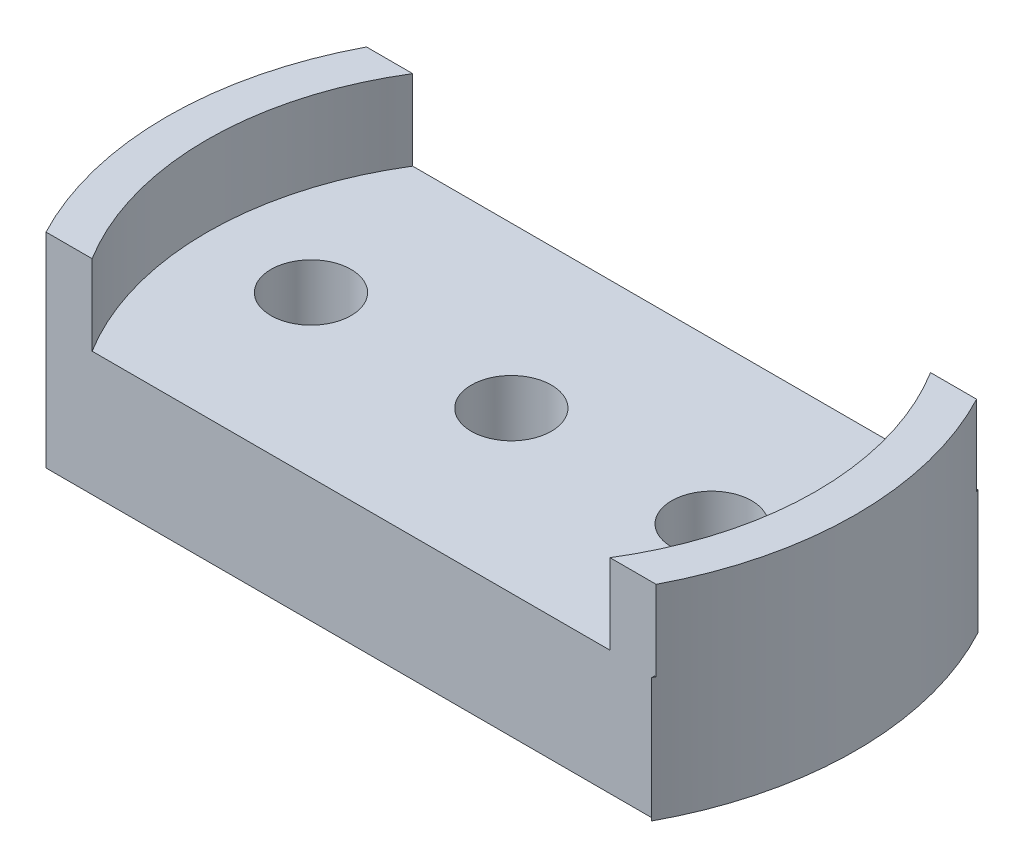
ISO-10303-21;
HEADER;
FILE_DESCRIPTION(('STEP AP214'),'2;1');
FILE_NAME('part.step','',(''),(''),'','','');
FILE_SCHEMA(('AUTOMOTIVE_DESIGN { 1 0 10303 214 1 1 1 1 }'));
ENDSEC;
DATA;
#1=APPLICATION_CONTEXT('core data for automotive mechanical design processes');
#2=APPLICATION_PROTOCOL_DEFINITION('international standard','automotive_design',2000,#1);
#3=PRODUCT_CONTEXT('',#1,'mechanical');
#4=PRODUCT('Part','Part','',(#3));
#5=PRODUCT_RELATED_PRODUCT_CATEGORY('part','',(#4));
#6=PRODUCT_DEFINITION_FORMATION('','',#4);
#7=PRODUCT_DEFINITION_CONTEXT('part definition',#1,'design');
#8=PRODUCT_DEFINITION('design','',#6,#7);
#9=PRODUCT_DEFINITION_SHAPE('','',#8);
#10=(LENGTH_UNIT() NAMED_UNIT(*) SI_UNIT(.MILLI.,.METRE.));
#11=(NAMED_UNIT(*) PLANE_ANGLE_UNIT() SI_UNIT($,.RADIAN.));
#12=(NAMED_UNIT(*) SI_UNIT($,.STERADIAN.) SOLID_ANGLE_UNIT());
#13=UNCERTAINTY_MEASURE_WITH_UNIT(LENGTH_MEASURE(1.E-05),#10,'distance_accuracy_value','');
#14=(GEOMETRIC_REPRESENTATION_CONTEXT(3) GLOBAL_UNCERTAINTY_ASSIGNED_CONTEXT((#13)) GLOBAL_UNIT_ASSIGNED_CONTEXT((#10,
#11,#12)) REPRESENTATION_CONTEXT('',''));
#15=CARTESIAN_POINT('',(0.,0.,0.));
#16=DIRECTION('',(0.,0.,1.));
#17=DIRECTION('',(1.,0.,0.));
#18=AXIS2_PLACEMENT_3D('',#15,#16,#17);
#19=CARTESIAN_POINT('',(0.,15.5,0.));
#20=DIRECTION('',(0.,1.,0.));
#21=DIRECTION('',(0.,0.,1.));
#22=AXIS2_PLACEMENT_3D('',#19,#20,#21);
#23=PLANE('',#22);
#24=CARTESIAN_POINT('',(25.,15.5,0.));
#25=DIRECTION('',(0.,1.,0.));
#26=DIRECTION('',(0.,0.,1.));
#27=AXIS2_PLACEMENT_3D('',#24,#25,#26);
#28=CIRCLE('',#27,5.);
#29=CARTESIAN_POINT('',(25.,15.5,5.));
#30=VERTEX_POINT('',#29);
#31=EDGE_CURVE('E312',#30,#30,#28,.T.);
#32=ORIENTED_EDGE('',*,*,#31,.F.);
#33=EDGE_LOOP('',(#32));
#34=FACE_BOUND('',#33,.T.);
#35=CARTESIAN_POINT('',(-25.,15.5,0.));
#36=DIRECTION('',(0.,1.,0.));
#37=DIRECTION('',(0.,0.,1.));
#38=AXIS2_PLACEMENT_3D('',#35,#36,#37);
#39=CIRCLE('',#38,5.);
#40=CARTESIAN_POINT('',(-25.,15.5,5.));
#41=VERTEX_POINT('',#40);
#42=EDGE_CURVE('E316',#41,#41,#39,.T.);
#43=ORIENTED_EDGE('',*,*,#42,.F.);
#44=EDGE_LOOP('',(#43));
#45=FACE_BOUND('',#44,.T.);
#46=CARTESIAN_POINT('',(0.,15.5,0.));
#47=DIRECTION('',(0.,1.,0.));
#48=DIRECTION('',(0.,0.,1.));
#49=AXIS2_PLACEMENT_3D('',#46,#47,#48);
#50=CIRCLE('',#49,5.);
#51=CARTESIAN_POINT('',(0.,15.5,5.));
#52=VERTEX_POINT('',#51);
#53=EDGE_CURVE('E298',#52,#52,#50,.T.);
#54=ORIENTED_EDGE('',*,*,#53,.F.);
#55=EDGE_LOOP('',(#54));
#56=FACE_BOUND('',#55,.T.);
#57=DIRECTION('',(-1.,0.,0.));
#58=VECTOR('',#57,1.);
#59=CARTESIAN_POINT('',(-38.0657326213486,15.5,20.));
#60=LINE('',#59,#58);
#61=CARTESIAN_POINT('',(32.310988842807,15.5,20.));
#62=VERTEX_POINT('',#61);
#63=CARTESIAN_POINT('',(-32.310988842807,15.5,20.));
#64=VERTEX_POINT('',#63);
#65=EDGE_CURVE('E257',#62,#64,#60,.T.);
#66=ORIENTED_EDGE('',*,*,#65,.F.);
#67=CARTESIAN_POINT('',(0.,15.5,0.));
#68=DIRECTION('',(0.,-1.,0.));
#69=DIRECTION('',(0.,0.,1.));
#70=AXIS2_PLACEMENT_3D('',#67,#68,#69);
#71=CIRCLE('',#70,38.);
#72=CARTESIAN_POINT('',(32.310988842807,15.5,-20.));
#73=VERTEX_POINT('',#72);
#74=EDGE_CURVE('E130',#73,#62,#71,.T.);
#75=ORIENTED_EDGE('',*,*,#74,.F.);
#76=DIRECTION('',(1.,0.,0.));
#77=VECTOR('',#76,1.);
#78=CARTESIAN_POINT('',(-38.0657326213486,15.5,-20.));
#79=LINE('',#78,#77);
#80=CARTESIAN_POINT('',(-32.310988842807,15.5,-20.));
#81=VERTEX_POINT('',#80);
#82=EDGE_CURVE('E280',#81,#73,#79,.T.);
#83=ORIENTED_EDGE('',*,*,#82,.F.);
#84=CARTESIAN_POINT('',(0.,15.5,0.));
#85=DIRECTION('',(0.,-1.,0.));
#86=DIRECTION('',(0.,0.,1.));
#87=AXIS2_PLACEMENT_3D('',#84,#85,#86);
#88=CIRCLE('',#87,38.);
#89=EDGE_CURVE('E186',#64,#81,#88,.T.);
#90=ORIENTED_EDGE('',*,*,#89,.F.);
#91=EDGE_LOOP('',(#66,#75,#83,#90));
#92=FACE_BOUND('',#91,.T.);
#93=ADVANCED_FACE('F39',(#34,#45,#56,#92),#23,.T.);
#94=DIRECTION('',(0.,0.,-1.));
#95=VECTOR('',#94,1.);
#96=CARTESIAN_POINT('',(37.8745162901658,15.5,-20.));
#97=LINE('',#96,#95);
#98=CARTESIAN_POINT('',(37.8745162901658,15.5,-20.));
#99=VERTEX_POINT('',#98);
#100=CARTESIAN_POINT('',(37.8745162901658,15.5,-20.3597891881514));
#101=VERTEX_POINT('',#100);
#102=EDGE_CURVE('E277',#99,#101,#97,.T.);
#103=ORIENTED_EDGE('',*,*,#102,.F.);
#104=DIRECTION('',(-1.,0.,0.));
#105=VECTOR('',#104,1.);
#106=CARTESIAN_POINT('',(32.310988842807,15.5,-20.));
#107=LINE('',#106,#105);
#108=CARTESIAN_POINT('',(38.0657326213486,15.5,-20.));
#109=VERTEX_POINT('',#108);
#110=EDGE_CURVE('E55',#109,#99,#107,.T.);
#111=ORIENTED_EDGE('',*,*,#110,.F.);
#112=CARTESIAN_POINT('',(0.,15.5,0.));
#113=DIRECTION('',(0.,1.,0.));
#114=DIRECTION('',(0.,0.,1.));
#115=AXIS2_PLACEMENT_3D('',#112,#113,#114);
#116=CIRCLE('',#115,43.);
#117=EDGE_CURVE('E147',#109,#101,#116,.T.);
#118=ORIENTED_EDGE('',*,*,#117,.T.);
#119=EDGE_LOOP('',(#103,#111,#118));
#120=FACE_BOUND('',#119,.T.);
#121=ADVANCED_FACE('F266',(#120),#23,.T.);
#122=CARTESIAN_POINT('',(0.,15.5,0.));
#123=DIRECTION('',(0.,-1.,0.));
#124=DIRECTION('',(0.,0.,-1.));
#125=AXIS2_PLACEMENT_3D('',#122,#123,#124);
#126=CYLINDRICAL_SURFACE('',#125,43.);
#127=CARTESIAN_POINT('',(0.,0.,0.));
#128=DIRECTION('',(0.,1.,0.));
#129=DIRECTION('',(0.,0.,1.));
#130=AXIS2_PLACEMENT_3D('',#127,#128,#129);
#131=CIRCLE('',#130,43.);
#132=CARTESIAN_POINT('',(-38.0657326213486,0.,-20.));
#133=VERTEX_POINT('',#132);
#134=CARTESIAN_POINT('',(-38.0657326213486,0.,20.));
#135=VERTEX_POINT('',#134);
#136=EDGE_CURVE('E146',#133,#135,#131,.T.);
#137=ORIENTED_EDGE('',*,*,#136,.T.);
#138=DIRECTION('',(0.,-1.,0.));
#139=VECTOR('',#138,1.);
#140=CARTESIAN_POINT('',(-38.0657326213486,25.5,20.));
#141=LINE('',#140,#139);
#142=CARTESIAN_POINT('',(-38.0657326213486,25.5,20.));
#143=VERTEX_POINT('',#142);
#144=EDGE_CURVE('E134',#143,#135,#141,.T.);
#145=ORIENTED_EDGE('',*,*,#144,.F.);
#146=CARTESIAN_POINT('',(0.,25.5,0.));
#147=DIRECTION('',(0.,1.,0.));
#148=DIRECTION('',(0.,0.,1.));
#149=AXIS2_PLACEMENT_3D('',#146,#147,#148);
#150=CIRCLE('',#149,43.);
#151=CARTESIAN_POINT('',(-38.0657326213486,25.5,-20.));
#152=VERTEX_POINT('',#151);
#153=EDGE_CURVE('E192',#152,#143,#150,.T.);
#154=ORIENTED_EDGE('',*,*,#153,.F.);
#155=DIRECTION('',(0.,-1.,0.));
#156=VECTOR('',#155,1.);
#157=CARTESIAN_POINT('',(-38.0657326213486,25.5,-20.));
#158=LINE('',#157,#156);
#159=EDGE_CURVE('E207',#152,#133,#158,.T.);
#160=ORIENTED_EDGE('',*,*,#159,.T.);
#161=EDGE_LOOP('',(#137,#145,#154,#160));
#162=FACE_BOUND('',#161,.T.);
#163=ADVANCED_FACE('F229',(#162),#126,.T.);
#164=DIRECTION('',(0.,0.,-1.));
#165=VECTOR('',#164,1.);
#166=CARTESIAN_POINT('',(37.8745162901658,15.5,20.));
#167=LINE('',#166,#165);
#168=CARTESIAN_POINT('',(37.8745162901658,15.5,20.3597891881514));
#169=VERTEX_POINT('',#168);
#170=CARTESIAN_POINT('',(37.8745162901658,15.5,20.));
#171=VERTEX_POINT('',#170);
#172=EDGE_CURVE('E259',#169,#171,#167,.T.);
#173=ORIENTED_EDGE('',*,*,#172,.F.);
#174=CARTESIAN_POINT('',(38.0657326213486,15.5,20.));
#175=VERTEX_POINT('',#174);
#176=EDGE_CURVE('E77',#169,#175,#116,.T.);
#177=ORIENTED_EDGE('',*,*,#176,.T.);
#178=DIRECTION('',(1.,0.,0.));
#179=VECTOR('',#178,1.);
#180=CARTESIAN_POINT('',(32.310988842807,15.5,20.));
#181=LINE('',#180,#179);
#182=EDGE_CURVE('E116',#171,#175,#181,.T.);
#183=ORIENTED_EDGE('',*,*,#182,.F.);
#184=EDGE_LOOP('',(#173,#177,#183));
#185=FACE_BOUND('',#184,.T.);
#186=ADVANCED_FACE('F263',(#185),#23,.T.);
#187=ORIENTED_EDGE('',*,*,#176,.F.);
#188=DIRECTION('',(0.,-1.,0.));
#189=VECTOR('',#188,1.);
#190=CARTESIAN_POINT('',(37.8745162901658,15.5,20.3597891881514));
#191=LINE('',#190,#189);
#192=CARTESIAN_POINT('',(37.8745162901658,0.,20.3597891881514));
#193=VERTEX_POINT('',#192);
#194=EDGE_CURVE('E181',#169,#193,#191,.T.);
#195=ORIENTED_EDGE('',*,*,#194,.T.);
#196=CARTESIAN_POINT('',(37.8745162901658,0.,-20.3597891881514));
#197=VERTEX_POINT('',#196);
#198=EDGE_CURVE('E151',#193,#197,#131,.T.);
#199=ORIENTED_EDGE('',*,*,#198,.T.);
#200=DIRECTION('',(0.,-1.,0.));
#201=VECTOR('',#200,1.);
#202=CARTESIAN_POINT('',(37.8745162901658,15.5,-20.3597891881514));
#203=LINE('',#202,#201);
#204=EDGE_CURVE('E187',#197,#101,#203,.F.);
#205=ORIENTED_EDGE('',*,*,#204,.T.);
#206=ORIENTED_EDGE('',*,*,#117,.F.);
#207=DIRECTION('',(0.,-1.,0.));
#208=VECTOR('',#207,1.);
#209=CARTESIAN_POINT('',(38.0657326213486,25.5,-20.));
#210=LINE('',#209,#208);
#211=CARTESIAN_POINT('',(38.0657326213486,25.5,-20.));
#212=VERTEX_POINT('',#211);
#213=EDGE_CURVE('E120',#212,#109,#210,.T.);
#214=ORIENTED_EDGE('',*,*,#213,.F.);
#215=CARTESIAN_POINT('',(0.,25.5,0.));
#216=DIRECTION('',(0.,1.,0.));
#217=DIRECTION('',(0.,0.,1.));
#218=AXIS2_PLACEMENT_3D('',#215,#216,#217);
#219=CIRCLE('',#218,43.);
#220=CARTESIAN_POINT('',(38.0657326213486,25.5,20.));
#221=VERTEX_POINT('',#220);
#222=EDGE_CURVE('E103',#221,#212,#219,.T.);
#223=ORIENTED_EDGE('',*,*,#222,.F.);
#224=DIRECTION('',(0.,-1.,0.));
#225=VECTOR('',#224,1.);
#226=CARTESIAN_POINT('',(38.0657326213486,25.5,20.));
#227=LINE('',#226,#225);
#228=EDGE_CURVE('E113',#221,#175,#227,.T.);
#229=ORIENTED_EDGE('',*,*,#228,.T.);
#230=EDGE_LOOP('',(#187,#195,#199,#205,#206,#214,#223,#229));
#231=FACE_BOUND('',#230,.T.);
#232=ADVANCED_FACE('F41',(#231),#126,.T.);
#233=CARTESIAN_POINT('',(0.,0.,0.));
#234=DIRECTION('',(0.,1.,0.));
#235=DIRECTION('',(0.,0.,1.));
#236=AXIS2_PLACEMENT_3D('',#233,#234,#235);
#237=PLANE('',#236);
#238=CARTESIAN_POINT('',(25.,0.,0.));
#239=DIRECTION('',(0.,-1.,0.));
#240=DIRECTION('',(0.,0.,-1.));
#241=AXIS2_PLACEMENT_3D('',#238,#239,#240);
#242=CIRCLE('',#241,5.);
#243=CARTESIAN_POINT('',(25.,0.,-5.));
#244=VERTEX_POINT('',#243);
#245=EDGE_CURVE('E320',#244,#244,#242,.T.);
#246=ORIENTED_EDGE('',*,*,#245,.F.);
#247=EDGE_LOOP('',(#246));
#248=FACE_BOUND('',#247,.T.);
#249=CARTESIAN_POINT('',(-25.,0.,0.));
#250=DIRECTION('',(0.,-1.,0.));
#251=DIRECTION('',(0.,0.,1.));
#252=AXIS2_PLACEMENT_3D('',#249,#250,#251);
#253=CIRCLE('',#252,5.);
#254=CARTESIAN_POINT('',(-25.,0.,5.));
#255=VERTEX_POINT('',#254);
#256=EDGE_CURVE('E321',#255,#255,#253,.T.);
#257=ORIENTED_EDGE('',*,*,#256,.F.);
#258=EDGE_LOOP('',(#257));
#259=FACE_BOUND('',#258,.T.);
#260=CARTESIAN_POINT('',(0.,0.,0.));
#261=DIRECTION('',(0.,-1.,0.));
#262=DIRECTION('',(0.,0.,-1.));
#263=AXIS2_PLACEMENT_3D('',#260,#261,#262);
#264=CIRCLE('',#263,5.);
#265=CARTESIAN_POINT('',(0.,0.,-5.));
#266=VERTEX_POINT('',#265);
#267=EDGE_CURVE('E308',#266,#266,#264,.T.);
#268=ORIENTED_EDGE('',*,*,#267,.F.);
#269=EDGE_LOOP('',(#268));
#270=FACE_BOUND('',#269,.T.);
#271=DIRECTION('',(0.,0.,-1.));
#272=VECTOR('',#271,1.);
#273=CARTESIAN_POINT('',(37.8745162901658,0.,0.));
#274=LINE('',#273,#272);
#275=CARTESIAN_POINT('',(37.8745162901658,0.,20.));
#276=VERTEX_POINT('',#275);
#277=EDGE_CURVE('E48',#193,#276,#274,.T.);
#278=ORIENTED_EDGE('',*,*,#277,.T.);
#279=DIRECTION('',(-1.,0.,0.));
#280=VECTOR('',#279,1.);
#281=CARTESIAN_POINT('',(0.,0.,20.));
#282=LINE('',#281,#280);
#283=EDGE_CURVE('E11',#276,#135,#282,.T.);
#284=ORIENTED_EDGE('',*,*,#283,.T.);
#285=ORIENTED_EDGE('',*,*,#136,.F.);
#286=DIRECTION('',(1.,0.,0.));
#287=VECTOR('',#286,1.);
#288=CARTESIAN_POINT('',(0.,0.,-20.));
#289=LINE('',#288,#287);
#290=CARTESIAN_POINT('',(37.8745162901658,0.,-20.));
#291=VERTEX_POINT('',#290);
#292=EDGE_CURVE('E150',#133,#291,#289,.T.);
#293=ORIENTED_EDGE('',*,*,#292,.T.);
#294=DIRECTION('',(0.,0.,-1.));
#295=VECTOR('',#294,1.);
#296=CARTESIAN_POINT('',(37.8745162901658,0.,0.));
#297=LINE('',#296,#295);
#298=EDGE_CURVE('E158',#291,#197,#297,.T.);
#299=ORIENTED_EDGE('',*,*,#298,.T.);
#300=ORIENTED_EDGE('',*,*,#198,.F.);
#301=EDGE_LOOP('',(#278,#284,#285,#293,#299,#300));
#302=FACE_BOUND('',#301,.T.);
#303=ADVANCED_FACE('F167',(#248,#259,#270,#302),#237,.F.);
#304=CARTESIAN_POINT('',(0.,25.5,0.));
#305=DIRECTION('',(0.,-1.,0.));
#306=DIRECTION('',(0.,0.,-1.));
#307=AXIS2_PLACEMENT_3D('',#304,#305,#306);
#308=CYLINDRICAL_SURFACE('',#307,38.);
#309=ORIENTED_EDGE('',*,*,#74,.T.);
#310=DIRECTION('',(0.,-1.,0.));
#311=VECTOR('',#310,1.);
#312=CARTESIAN_POINT('',(32.310988842807,25.5,20.));
#313=LINE('',#312,#311);
#314=CARTESIAN_POINT('',(32.310988842807,25.5,20.));
#315=VERTEX_POINT('',#314);
#316=EDGE_CURVE('E119',#315,#62,#313,.T.);
#317=ORIENTED_EDGE('',*,*,#316,.F.);
#318=CARTESIAN_POINT('',(0.,25.5,0.));
#319=DIRECTION('',(0.,-1.,0.));
#320=DIRECTION('',(0.,0.,1.));
#321=AXIS2_PLACEMENT_3D('',#318,#319,#320);
#322=CIRCLE('',#321,38.);
#323=CARTESIAN_POINT('',(32.310988842807,25.5,-20.));
#324=VERTEX_POINT('',#323);
#325=EDGE_CURVE('E106',#324,#315,#322,.T.);
#326=ORIENTED_EDGE('',*,*,#325,.F.);
#327=DIRECTION('',(0.,-1.,0.));
#328=VECTOR('',#327,1.);
#329=CARTESIAN_POINT('',(32.310988842807,25.5,-20.));
#330=LINE('',#329,#328);
#331=EDGE_CURVE('E126',#324,#73,#330,.T.);
#332=ORIENTED_EDGE('',*,*,#331,.T.);
#333=EDGE_LOOP('',(#309,#317,#326,#332));
#334=FACE_BOUND('',#333,.T.);
#335=ADVANCED_FACE('F288',(#334),#308,.F.);
#336=CARTESIAN_POINT('',(32.310988842807,25.5,20.));
#337=DIRECTION('',(0.,0.,-1.));
#338=DIRECTION('',(-1.,0.,0.));
#339=AXIS2_PLACEMENT_3D('',#336,#337,#338);
#340=PLANE('',#339);
#341=ORIENTED_EDGE('',*,*,#316,.T.);
#342=ORIENTED_EDGE('',*,*,#65,.T.);
#343=DIRECTION('',(0.,-1.,0.));
#344=VECTOR('',#343,1.);
#345=CARTESIAN_POINT('',(-32.310988842807,25.5,20.));
#346=LINE('',#345,#344);
#347=CARTESIAN_POINT('',(-32.310988842807,25.5,20.));
#348=VERTEX_POINT('',#347);
#349=EDGE_CURVE('E216',#348,#64,#346,.T.);
#350=ORIENTED_EDGE('',*,*,#349,.F.);
#351=DIRECTION('',(1.,0.,0.));
#352=VECTOR('',#351,1.);
#353=CARTESIAN_POINT('',(-38.0657326213486,25.5,20.));
#354=LINE('',#353,#352);
#355=EDGE_CURVE('E199',#143,#348,#354,.T.);
#356=ORIENTED_EDGE('',*,*,#355,.F.);
#357=ORIENTED_EDGE('',*,*,#144,.T.);
#358=ORIENTED_EDGE('',*,*,#283,.F.);
#359=DIRECTION('',(0.,1.,0.));
#360=VECTOR('',#359,1.);
#361=CARTESIAN_POINT('',(37.8745162901658,-4.5,20.));
#362=LINE('',#361,#360);
#363=EDGE_CURVE('E182',#276,#171,#362,.T.);
#364=ORIENTED_EDGE('',*,*,#363,.T.);
#365=ORIENTED_EDGE('',*,*,#182,.T.);
#366=ORIENTED_EDGE('',*,*,#228,.F.);
#367=DIRECTION('',(1.,0.,0.));
#368=VECTOR('',#367,1.);
#369=CARTESIAN_POINT('',(32.310988842807,25.5,20.));
#370=LINE('',#369,#368);
#371=EDGE_CURVE('E99',#315,#221,#370,.T.);
#372=ORIENTED_EDGE('',*,*,#371,.F.);
#373=EDGE_LOOP('',(#341,#342,#350,#356,#357,#358,#364,#365,#366,#372));
#374=FACE_BOUND('',#373,.T.);
#375=ADVANCED_FACE('F114',(#374),#340,.F.);
#376=CARTESIAN_POINT('',(32.310988842807,25.5,-20.));
#377=DIRECTION('',(0.,0.,1.));
#378=DIRECTION('',(1.,0.,0.));
#379=AXIS2_PLACEMENT_3D('',#376,#377,#378);
#380=PLANE('',#379);
#381=ORIENTED_EDGE('',*,*,#110,.T.);
#382=DIRECTION('',(0.,1.,0.));
#383=VECTOR('',#382,1.);
#384=CARTESIAN_POINT('',(37.8745162901658,-4.5,-20.));
#385=LINE('',#384,#383);
#386=EDGE_CURVE('E261',#291,#99,#385,.T.);
#387=ORIENTED_EDGE('',*,*,#386,.F.);
#388=ORIENTED_EDGE('',*,*,#292,.F.);
#389=ORIENTED_EDGE('',*,*,#159,.F.);
#390=DIRECTION('',(-1.,0.,0.));
#391=VECTOR('',#390,1.);
#392=CARTESIAN_POINT('',(-38.0657326213486,25.5,-20.));
#393=LINE('',#392,#391);
#394=CARTESIAN_POINT('',(-32.310988842807,25.5,-20.));
#395=VERTEX_POINT('',#394);
#396=EDGE_CURVE('E88',#395,#152,#393,.T.);
#397=ORIENTED_EDGE('',*,*,#396,.F.);
#398=DIRECTION('',(0.,-1.,0.));
#399=VECTOR('',#398,1.);
#400=CARTESIAN_POINT('',(-32.310988842807,25.5,-20.));
#401=LINE('',#400,#399);
#402=EDGE_CURVE('E212',#395,#81,#401,.T.);
#403=ORIENTED_EDGE('',*,*,#402,.T.);
#404=ORIENTED_EDGE('',*,*,#82,.T.);
#405=ORIENTED_EDGE('',*,*,#331,.F.);
#406=DIRECTION('',(-1.,0.,0.));
#407=VECTOR('',#406,1.);
#408=CARTESIAN_POINT('',(32.310988842807,25.5,-20.));
#409=LINE('',#408,#407);
#410=EDGE_CURVE('E64',#212,#324,#409,.T.);
#411=ORIENTED_EDGE('',*,*,#410,.F.);
#412=ORIENTED_EDGE('',*,*,#213,.T.);
#413=EDGE_LOOP('',(#381,#387,#388,#389,#397,#403,#404,#405,#411,#412));
#414=FACE_BOUND('',#413,.T.);
#415=ADVANCED_FACE('F284',(#414),#380,.F.);
#416=CARTESIAN_POINT('',(0.,25.5,0.));
#417=DIRECTION('',(0.,1.,0.));
#418=DIRECTION('',(0.,0.,1.));
#419=AXIS2_PLACEMENT_3D('',#416,#417,#418);
#420=PLANE('',#419);
#421=ORIENTED_EDGE('',*,*,#325,.T.);
#422=ORIENTED_EDGE('',*,*,#371,.T.);
#423=ORIENTED_EDGE('',*,*,#222,.T.);
#424=ORIENTED_EDGE('',*,*,#410,.T.);
#425=EDGE_LOOP('',(#421,#422,#423,#424));
#426=FACE_BOUND('',#425,.T.);
#427=ADVANCED_FACE('F101',(#426),#420,.T.);
#428=CARTESIAN_POINT('',(0.,25.5,0.));
#429=DIRECTION('',(0.,-1.,0.));
#430=DIRECTION('',(0.,0.,-1.));
#431=AXIS2_PLACEMENT_3D('',#428,#429,#430);
#432=CYLINDRICAL_SURFACE('',#431,38.);
#433=ORIENTED_EDGE('',*,*,#89,.T.);
#434=ORIENTED_EDGE('',*,*,#402,.F.);
#435=CARTESIAN_POINT('',(0.,25.5,0.));
#436=DIRECTION('',(0.,-1.,0.));
#437=DIRECTION('',(0.,0.,1.));
#438=AXIS2_PLACEMENT_3D('',#435,#436,#437);
#439=CIRCLE('',#438,38.);
#440=EDGE_CURVE('E203',#348,#395,#439,.T.);
#441=ORIENTED_EDGE('',*,*,#440,.F.);
#442=ORIENTED_EDGE('',*,*,#349,.T.);
#443=EDGE_LOOP('',(#433,#434,#441,#442));
#444=FACE_BOUND('',#443,.T.);
#445=ADVANCED_FACE('F295',(#444),#432,.F.);
#446=CARTESIAN_POINT('',(0.,25.5,0.));
#447=DIRECTION('',(0.,1.,0.));
#448=DIRECTION('',(0.,0.,1.));
#449=AXIS2_PLACEMENT_3D('',#446,#447,#448);
#450=PLANE('',#449);
#451=ORIENTED_EDGE('',*,*,#153,.T.);
#452=ORIENTED_EDGE('',*,*,#355,.T.);
#453=ORIENTED_EDGE('',*,*,#440,.T.);
#454=ORIENTED_EDGE('',*,*,#396,.T.);
#455=EDGE_LOOP('',(#451,#452,#453,#454));
#456=FACE_BOUND('',#455,.T.);
#457=ADVANCED_FACE('F353',(#456),#450,.T.);
#458=CARTESIAN_POINT('',(37.8745162901658,-4.5,-20.));
#459=DIRECTION('',(1.,0.,0.));
#460=DIRECTION('',(0.,0.,-1.));
#461=AXIS2_PLACEMENT_3D('',#458,#459,#460);
#462=PLANE('',#461);
#463=ORIENTED_EDGE('',*,*,#298,.F.);
#464=ORIENTED_EDGE('',*,*,#386,.T.);
#465=ORIENTED_EDGE('',*,*,#102,.T.);
#466=ORIENTED_EDGE('',*,*,#204,.F.);
#467=EDGE_LOOP('',(#463,#464,#465,#466));
#468=FACE_BOUND('',#467,.T.);
#469=ADVANCED_FACE('F302',(#468),#462,.F.);
#470=CARTESIAN_POINT('',(37.8745162901658,-4.5,20.));
#471=DIRECTION('',(1.,0.,0.));
#472=DIRECTION('',(0.,0.,-1.));
#473=AXIS2_PLACEMENT_3D('',#470,#471,#472);
#474=PLANE('',#473);
#475=ORIENTED_EDGE('',*,*,#172,.T.);
#476=ORIENTED_EDGE('',*,*,#363,.F.);
#477=ORIENTED_EDGE('',*,*,#277,.F.);
#478=ORIENTED_EDGE('',*,*,#194,.F.);
#479=EDGE_LOOP('',(#475,#476,#477,#478));
#480=FACE_BOUND('',#479,.T.);
#481=ADVANCED_FACE('F179',(#480),#474,.F.);
#482=CARTESIAN_POINT('',(0.,20.,0.));
#483=DIRECTION('',(0.,-1.,0.));
#484=DIRECTION('',(0.,0.,-1.));
#485=AXIS2_PLACEMENT_3D('',#482,#483,#484);
#486=CYLINDRICAL_SURFACE('',#485,5.);
#487=ORIENTED_EDGE('',*,*,#53,.T.);
#488=EDGE_LOOP('',(#487));
#489=FACE_BOUND('',#488,.T.);
#490=ORIENTED_EDGE('',*,*,#267,.T.);
#491=EDGE_LOOP('',(#490));
#492=FACE_BOUND('',#491,.T.);
#493=ADVANCED_FACE('F337',(#489,#492),#486,.F.);
#494=CARTESIAN_POINT('',(-25.,20.,0.));
#495=DIRECTION('',(0.,-1.,0.));
#496=DIRECTION('',(0.,0.,-1.));
#497=AXIS2_PLACEMENT_3D('',#494,#495,#496);
#498=CYLINDRICAL_SURFACE('',#497,5.);
#499=ORIENTED_EDGE('',*,*,#42,.T.);
#500=EDGE_LOOP('',(#499));
#501=FACE_BOUND('',#500,.T.);
#502=ORIENTED_EDGE('',*,*,#256,.T.);
#503=EDGE_LOOP('',(#502));
#504=FACE_BOUND('',#503,.T.);
#505=ADVANCED_FACE('F339',(#501,#504),#498,.F.);
#506=CARTESIAN_POINT('',(25.,20.,0.));
#507=DIRECTION('',(0.,-1.,0.));
#508=DIRECTION('',(0.,0.,-1.));
#509=AXIS2_PLACEMENT_3D('',#506,#507,#508);
#510=CYLINDRICAL_SURFACE('',#509,5.);
#511=ORIENTED_EDGE('',*,*,#31,.T.);
#512=EDGE_LOOP('',(#511));
#513=FACE_BOUND('',#512,.T.);
#514=ORIENTED_EDGE('',*,*,#245,.T.);
#515=EDGE_LOOP('',(#514));
#516=FACE_BOUND('',#515,.T.);
#517=ADVANCED_FACE('F329',(#513,#516),#510,.F.);
#518=CLOSED_SHELL('',(#93,#121,#163,#186,#232,#303,#335,#375,#415,#427,#445,#457,#469,#481,#493,
#505,#517));
#519=MANIFOLD_SOLID_BREP('B2',#518);
#520=ADVANCED_BREP_SHAPE_REPRESENTATION('',(#18,#519),#14);
#521=SHAPE_DEFINITION_REPRESENTATION(#9,#520);
ENDSEC;
END-ISO-10303-21;
